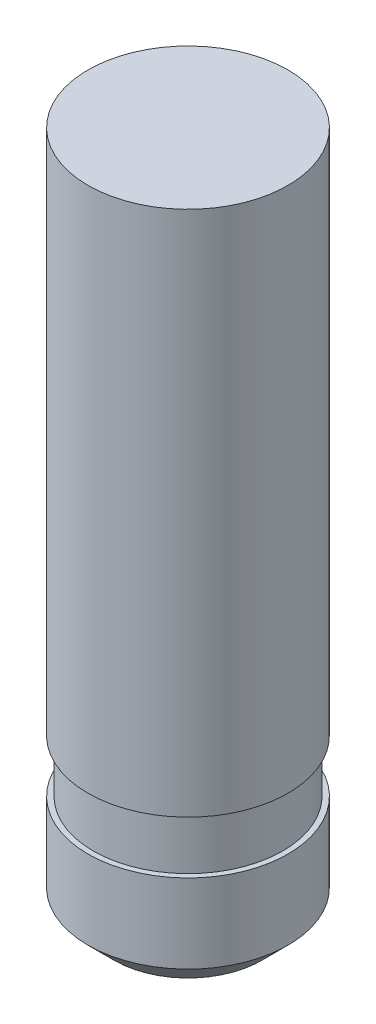
ISO-10303-21;
HEADER;
FILE_DESCRIPTION(('STEP AP214'),'2;1');
FILE_NAME('part.step','',(''),(''),'','','');
FILE_SCHEMA(('AUTOMOTIVE_DESIGN { 1 0 10303 214 1 1 1 1 }'));
ENDSEC;
DATA;
#1=APPLICATION_CONTEXT('core data for automotive mechanical design processes');
#2=APPLICATION_PROTOCOL_DEFINITION('international standard','automotive_design',2000,#1);
#3=PRODUCT_CONTEXT('',#1,'mechanical');
#4=PRODUCT('Part','Part','',(#3));
#5=PRODUCT_RELATED_PRODUCT_CATEGORY('part','',(#4));
#6=PRODUCT_DEFINITION_FORMATION('','',#4);
#7=PRODUCT_DEFINITION_CONTEXT('part definition',#1,'design');
#8=PRODUCT_DEFINITION('design','',#6,#7);
#9=PRODUCT_DEFINITION_SHAPE('','',#8);
#10=(LENGTH_UNIT() NAMED_UNIT(*) SI_UNIT(.MILLI.,.METRE.));
#11=(NAMED_UNIT(*) PLANE_ANGLE_UNIT() SI_UNIT($,.RADIAN.));
#12=(NAMED_UNIT(*) SI_UNIT($,.STERADIAN.) SOLID_ANGLE_UNIT());
#13=UNCERTAINTY_MEASURE_WITH_UNIT(LENGTH_MEASURE(1.E-05),#10,'distance_accuracy_value','');
#14=(GEOMETRIC_REPRESENTATION_CONTEXT(3) GLOBAL_UNCERTAINTY_ASSIGNED_CONTEXT((#13)) GLOBAL_UNIT_ASSIGNED_CONTEXT((#10,
#11,#12)) REPRESENTATION_CONTEXT('',''));
#15=CARTESIAN_POINT('',(0.,0.,0.));
#16=DIRECTION('',(0.,0.,1.));
#17=DIRECTION('',(1.,0.,0.));
#18=AXIS2_PLACEMENT_3D('',#15,#16,#17);
#19=CARTESIAN_POINT('',(0.,2.,0.));
#20=DIRECTION('',(0.,-1.,0.));
#21=DIRECTION('',(0.,0.,-1.));
#22=AXIS2_PLACEMENT_3D('',#19,#20,#21);
#23=CYLINDRICAL_SURFACE('',#22,1.9);
#24=CARTESIAN_POINT('',(0.,0.500000000000002,0.));
#25=DIRECTION('',(0.,1.,0.));
#26=DIRECTION('',(0.,0.,1.));
#27=AXIS2_PLACEMENT_3D('',#24,#25,#26);
#28=CIRCLE('',#27,1.9);
#29=CARTESIAN_POINT('',(0.,0.500000000000002,1.9));
#30=VERTEX_POINT('',#29);
#31=EDGE_CURVE('E51',#30,#30,#28,.T.);
#32=ORIENTED_EDGE('',*,*,#31,.T.);
#33=EDGE_LOOP('',(#32));
#34=FACE_BOUND('',#33,.T.);
#35=CARTESIAN_POINT('',(0.,2.,0.));
#36=DIRECTION('',(0.,1.,0.));
#37=DIRECTION('',(0.,0.,1.));
#38=AXIS2_PLACEMENT_3D('',#35,#36,#37);
#39=CIRCLE('',#38,1.9);
#40=CARTESIAN_POINT('',(0.,2.,1.9));
#41=VERTEX_POINT('',#40);
#42=EDGE_CURVE('E61',#41,#41,#39,.T.);
#43=ORIENTED_EDGE('',*,*,#42,.F.);
#44=EDGE_LOOP('',(#43));
#45=FACE_BOUND('',#44,.T.);
#46=ADVANCED_FACE('F42',(#34,#45),#23,.T.);
#47=CARTESIAN_POINT('',(0.,2.,0.));
#48=DIRECTION('',(0.,1.,0.));
#49=DIRECTION('',(0.,0.,1.));
#50=AXIS2_PLACEMENT_3D('',#47,#48,#49);
#51=PLANE('',#50);
#52=CARTESIAN_POINT('',(0.,2.,0.));
#53=DIRECTION('',(0.,1.,0.));
#54=DIRECTION('',(0.,0.,1.));
#55=AXIS2_PLACEMENT_3D('',#52,#53,#54);
#56=CIRCLE('',#55,1.8);
#57=CARTESIAN_POINT('',(0.,2.,1.8));
#58=VERTEX_POINT('',#57);
#59=EDGE_CURVE('E56',#58,#58,#56,.T.);
#60=ORIENTED_EDGE('',*,*,#59,.F.);
#61=EDGE_LOOP('',(#60));
#62=FACE_BOUND('',#61,.T.);
#63=ORIENTED_EDGE('',*,*,#42,.T.);
#64=EDGE_LOOP('',(#63));
#65=FACE_BOUND('',#64,.T.);
#66=ADVANCED_FACE('F100',(#62,#65),#51,.T.);
#67=CARTESIAN_POINT('',(0.,0.,0.));
#68=DIRECTION('',(0.,1.,0.));
#69=DIRECTION('',(0.,0.,1.));
#70=AXIS2_PLACEMENT_3D('',#67,#68,#69);
#71=PLANE('',#70);
#72=CARTESIAN_POINT('',(0.,0.,0.));
#73=DIRECTION('',(0.,1.,0.));
#74=DIRECTION('',(0.,0.,1.));
#75=AXIS2_PLACEMENT_3D('',#72,#73,#74);
#76=CIRCLE('',#75,1.4);
#77=CARTESIAN_POINT('',(0.,0.,1.4));
#78=VERTEX_POINT('',#77);
#79=EDGE_CURVE('E10',#78,#78,#76,.F.);
#80=ORIENTED_EDGE('',*,*,#79,.T.);
#81=EDGE_LOOP('',(#80));
#82=FACE_BOUND('',#81,.T.);
#83=ADVANCED_FACE('F104',(#82),#71,.F.);
#84=CARTESIAN_POINT('',(0.,3.,0.));
#85=DIRECTION('',(0.,-1.,0.));
#86=DIRECTION('',(0.,0.,-1.));
#87=AXIS2_PLACEMENT_3D('',#84,#85,#86);
#88=CYLINDRICAL_SURFACE('',#87,1.8);
#89=CARTESIAN_POINT('',(0.,3.,0.));
#90=DIRECTION('',(0.,1.,0.));
#91=DIRECTION('',(0.,0.,1.));
#92=AXIS2_PLACEMENT_3D('',#89,#90,#91);
#93=CIRCLE('',#92,1.8);
#94=CARTESIAN_POINT('',(0.,3.,1.8));
#95=VERTEX_POINT('',#94);
#96=EDGE_CURVE('E66',#95,#95,#93,.T.);
#97=ORIENTED_EDGE('',*,*,#96,.F.);
#98=EDGE_LOOP('',(#97));
#99=FACE_BOUND('',#98,.T.);
#100=ORIENTED_EDGE('',*,*,#59,.T.);
#101=EDGE_LOOP('',(#100));
#102=FACE_BOUND('',#101,.T.);
#103=ADVANCED_FACE('F85',(#99,#102),#88,.T.);
#104=CARTESIAN_POINT('',(0.,13.,0.));
#105=DIRECTION('',(0.,-1.,0.));
#106=DIRECTION('',(0.,0.,-1.));
#107=AXIS2_PLACEMENT_3D('',#104,#105,#106);
#108=CYLINDRICAL_SURFACE('',#107,1.9);
#109=CARTESIAN_POINT('',(0.,13.,0.));
#110=DIRECTION('',(0.,1.,0.));
#111=DIRECTION('',(0.,0.,1.));
#112=AXIS2_PLACEMENT_3D('',#109,#110,#111);
#113=CIRCLE('',#112,1.9);
#114=CARTESIAN_POINT('',(0.,13.,1.9));
#115=VERTEX_POINT('',#114);
#116=EDGE_CURVE('E71',#115,#115,#113,.T.);
#117=ORIENTED_EDGE('',*,*,#116,.F.);
#118=EDGE_LOOP('',(#117));
#119=FACE_BOUND('',#118,.T.);
#120=CARTESIAN_POINT('',(0.,3.,0.));
#121=DIRECTION('',(0.,1.,0.));
#122=DIRECTION('',(0.,0.,1.));
#123=AXIS2_PLACEMENT_3D('',#120,#121,#122);
#124=CIRCLE('',#123,1.9);
#125=CARTESIAN_POINT('',(0.,3.,1.9));
#126=VERTEX_POINT('',#125);
#127=EDGE_CURVE('E72',#126,#126,#124,.T.);
#128=ORIENTED_EDGE('',*,*,#127,.T.);
#129=EDGE_LOOP('',(#128));
#130=FACE_BOUND('',#129,.T.);
#131=ADVANCED_FACE('F82',(#119,#130),#108,.T.);
#132=CARTESIAN_POINT('',(0.,13.,0.));
#133=DIRECTION('',(0.,1.,0.));
#134=DIRECTION('',(0.,0.,1.));
#135=AXIS2_PLACEMENT_3D('',#132,#133,#134);
#136=PLANE('',#135);
#137=ORIENTED_EDGE('',*,*,#116,.T.);
#138=EDGE_LOOP('',(#137));
#139=FACE_BOUND('',#138,.T.);
#140=ADVANCED_FACE('F80',(#139),#136,.T.);
#141=CARTESIAN_POINT('',(0.,3.,0.));
#142=DIRECTION('',(0.,1.,0.));
#143=DIRECTION('',(0.,0.,1.));
#144=AXIS2_PLACEMENT_3D('',#141,#142,#143);
#145=PLANE('',#144);
#146=ORIENTED_EDGE('',*,*,#96,.T.);
#147=EDGE_LOOP('',(#146));
#148=FACE_BOUND('',#147,.T.);
#149=ORIENTED_EDGE('',*,*,#127,.F.);
#150=EDGE_LOOP('',(#149));
#151=FACE_BOUND('',#150,.T.);
#152=ADVANCED_FACE('F89',(#148,#151),#145,.F.);
#153=CARTESIAN_POINT('',(0.,0.500000000000002,0.));
#154=DIRECTION('',(0.,1.,0.));
#155=DIRECTION('',(0.,0.,1.));
#156=AXIS2_PLACEMENT_3D('',#153,#154,#155);
#157=CONICAL_SURFACE('',#156,1.9,0.78539816339745);
#158=ORIENTED_EDGE('',*,*,#79,.F.);
#159=EDGE_LOOP('',(#158));
#160=FACE_BOUND('',#159,.T.);
#161=ORIENTED_EDGE('',*,*,#31,.F.);
#162=EDGE_LOOP('',(#161));
#163=FACE_BOUND('',#162,.T.);
#164=ADVANCED_FACE('F45',(#160,#163),#157,.T.);
#165=CLOSED_SHELL('',(#46,#66,#83,#103,#131,#140,#152,#164));
#166=MANIFOLD_SOLID_BREP('B2',#165);
#167=ADVANCED_BREP_SHAPE_REPRESENTATION('',(#18,#166),#14);
#168=SHAPE_DEFINITION_REPRESENTATION(#9,#167);
ENDSEC;
END-ISO-10303-21;
